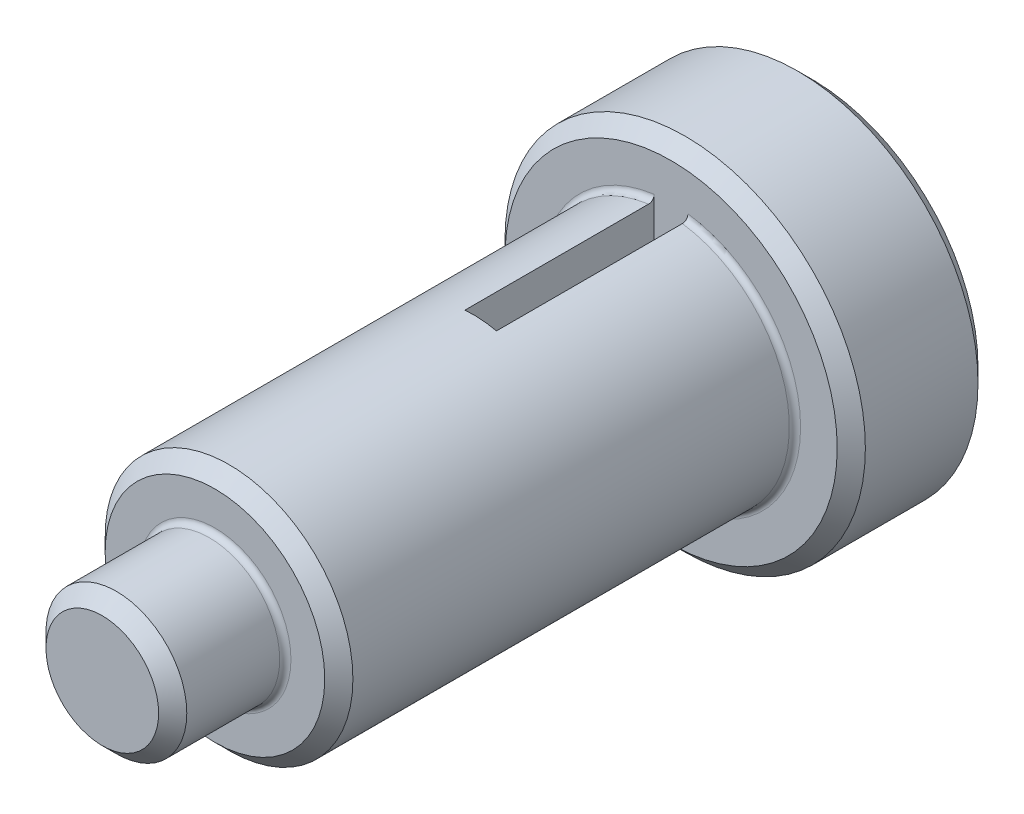
ISO-10303-21;
HEADER;
FILE_DESCRIPTION(('STEP AP214'),'2;1');
FILE_NAME('part.step','',(''),(''),'','','');
FILE_SCHEMA(('AUTOMOTIVE_DESIGN { 1 0 10303 214 1 1 1 1 }'));
ENDSEC;
DATA;
#1=APPLICATION_CONTEXT('core data for automotive mechanical design processes');
#2=APPLICATION_PROTOCOL_DEFINITION('international standard','automotive_design',2000,#1);
#3=PRODUCT_CONTEXT('',#1,'mechanical');
#4=PRODUCT('Part','Part','',(#3));
#5=PRODUCT_RELATED_PRODUCT_CATEGORY('part','',(#4));
#6=PRODUCT_DEFINITION_FORMATION('','',#4);
#7=PRODUCT_DEFINITION_CONTEXT('part definition',#1,'design');
#8=PRODUCT_DEFINITION('design','',#6,#7);
#9=PRODUCT_DEFINITION_SHAPE('','',#8);
#10=(LENGTH_UNIT() NAMED_UNIT(*) SI_UNIT(.MILLI.,.METRE.));
#11=(NAMED_UNIT(*) PLANE_ANGLE_UNIT() SI_UNIT($,.RADIAN.));
#12=(NAMED_UNIT(*) SI_UNIT($,.STERADIAN.) SOLID_ANGLE_UNIT());
#13=UNCERTAINTY_MEASURE_WITH_UNIT(LENGTH_MEASURE(1.E-05),#10,'distance_accuracy_value','');
#14=(GEOMETRIC_REPRESENTATION_CONTEXT(3) GLOBAL_UNCERTAINTY_ASSIGNED_CONTEXT((#13)) GLOBAL_UNIT_ASSIGNED_CONTEXT((#10,
#11,#12)) REPRESENTATION_CONTEXT('',''));
#15=CARTESIAN_POINT('',(0.,0.,0.));
#16=DIRECTION('',(0.,0.,1.));
#17=DIRECTION('',(1.,0.,0.));
#18=AXIS2_PLACEMENT_3D('',#15,#16,#17);
#19=CARTESIAN_POINT('',(0.,0.,25.));
#20=DIRECTION('',(0.,0.,-1.));
#21=DIRECTION('',(-1.,0.,0.));
#22=AXIS2_PLACEMENT_3D('',#19,#20,#21);
#23=CYLINDRICAL_SURFACE('',#22,32.);
#24=CARTESIAN_POINT('',(0.,0.,22.4999999999999));
#25=DIRECTION('',(0.,0.,1.));
#26=DIRECTION('',(1.,0.,0.));
#27=AXIS2_PLACEMENT_3D('',#24,#25,#26);
#28=CIRCLE('',#27,32.);
#29=CARTESIAN_POINT('',(32.,0.,22.4999999999999));
#30=VERTEX_POINT('',#29);
#31=EDGE_CURVE('E340',#30,#30,#28,.F.);
#32=ORIENTED_EDGE('',*,*,#31,.T.);
#33=EDGE_LOOP('',(#32));
#34=FACE_BOUND('',#33,.T.);
#35=CARTESIAN_POINT('',(0.,0.,2.50000000000002));
#36=DIRECTION('',(0.,0.,1.));
#37=DIRECTION('',(1.,0.,0.));
#38=AXIS2_PLACEMENT_3D('',#35,#36,#37);
#39=CIRCLE('',#38,32.);
#40=CARTESIAN_POINT('',(32.,0.,2.50000000000002));
#41=VERTEX_POINT('',#40);
#42=EDGE_CURVE('E337',#41,#41,#39,.T.);
#43=ORIENTED_EDGE('',*,*,#42,.T.);
#44=EDGE_LOOP('',(#43));
#45=FACE_BOUND('',#44,.T.);
#46=ADVANCED_FACE('F39',(#34,#45),#23,.T.);
#47=CARTESIAN_POINT('',(0.,0.,25.));
#48=DIRECTION('',(0.,0.,1.));
#49=DIRECTION('',(1.,0.,0.));
#50=AXIS2_PLACEMENT_3D('',#47,#48,#49);
#51=PLANE('',#50);
#52=CARTESIAN_POINT('',(0.,0.,25.));
#53=DIRECTION('',(0.,0.,1.));
#54=DIRECTION('',(1.,0.,0.));
#55=AXIS2_PLACEMENT_3D('',#52,#53,#54);
#56=CIRCLE('',#55,29.5);
#57=CARTESIAN_POINT('',(29.5,0.,25.));
#58=VERTEX_POINT('',#57);
#59=EDGE_CURVE('E330',#58,#58,#56,.T.);
#60=ORIENTED_EDGE('',*,*,#59,.T.);
#61=EDGE_LOOP('',(#60));
#62=FACE_BOUND('',#61,.T.);
#63=DIRECTION('',(0.,1.,0.));
#64=VECTOR('',#63,1.);
#65=CARTESIAN_POINT('',(3.,-32.,25.));
#66=LINE('',#65,#64);
#67=CARTESIAN_POINT('',(3.,15.7162336455017,25.));
#68=VERTEX_POINT('',#67);
#69=CARTESIAN_POINT('',(3.,22.8035085019828,25.));
#70=VERTEX_POINT('',#69);
#71=EDGE_CURVE('E60',#68,#70,#66,.T.);
#72=ORIENTED_EDGE('',*,*,#71,.T.);
#73=CARTESIAN_POINT('',(0.,0.,25.));
#74=DIRECTION('',(0.,0.,1.));
#75=DIRECTION('',(1.,0.,0.));
#76=AXIS2_PLACEMENT_3D('',#73,#74,#75);
#77=CIRCLE('',#76,23.);
#78=CARTESIAN_POINT('',(3.,-22.8035085019828,25.));
#79=VERTEX_POINT('',#78);
#80=EDGE_CURVE('E351',#70,#79,#77,.F.);
#81=ORIENTED_EDGE('',*,*,#80,.T.);
#82=CARTESIAN_POINT('',(3.,-15.7162336455017,25.));
#83=VERTEX_POINT('',#82);
#84=EDGE_CURVE('E68',#79,#83,#66,.T.);
#85=ORIENTED_EDGE('',*,*,#84,.T.);
#86=CARTESIAN_POINT('',(0.,0.,25.));
#87=DIRECTION('',(0.,0.,-1.));
#88=DIRECTION('',(-1.,0.,0.));
#89=AXIS2_PLACEMENT_3D('',#86,#87,#88);
#90=CIRCLE('',#89,16.);
#91=CARTESIAN_POINT('',(-2.99999999999999,-15.7162336455017,25.));
#92=VERTEX_POINT('',#91);
#93=EDGE_CURVE('E132',#92,#83,#90,.F.);
#94=ORIENTED_EDGE('',*,*,#93,.F.);
#95=DIRECTION('',(0.,1.,0.));
#96=VECTOR('',#95,1.);
#97=CARTESIAN_POINT('',(-2.99999999999999,-32.,25.));
#98=LINE('',#97,#96);
#99=CARTESIAN_POINT('',(-2.99999999999999,-22.8035085019828,25.));
#100=VERTEX_POINT('',#99);
#101=EDGE_CURVE('E139',#100,#92,#98,.T.);
#102=ORIENTED_EDGE('',*,*,#101,.F.);
#103=CARTESIAN_POINT('',(0.,0.,25.));
#104=DIRECTION('',(0.,0.,1.));
#105=DIRECTION('',(1.,0.,0.));
#106=AXIS2_PLACEMENT_3D('',#103,#104,#105);
#107=CIRCLE('',#106,23.);
#108=CARTESIAN_POINT('',(-2.99999999999999,22.8035085019828,25.));
#109=VERTEX_POINT('',#108);
#110=EDGE_CURVE('E137',#100,#109,#107,.F.);
#111=ORIENTED_EDGE('',*,*,#110,.T.);
#112=CARTESIAN_POINT('',(-2.99999999999999,15.7162336455017,25.));
#113=VERTEX_POINT('',#112);
#114=EDGE_CURVE('E123',#113,#109,#98,.T.);
#115=ORIENTED_EDGE('',*,*,#114,.F.);
#116=EDGE_CURVE('E135',#68,#113,#90,.F.);
#117=ORIENTED_EDGE('',*,*,#116,.F.);
#118=EDGE_LOOP('',(#72,#81,#85,#94,#102,#111,#115,#117));
#119=FACE_BOUND('',#118,.T.);
#120=ADVANCED_FACE('F134',(#62,#119),#51,.T.);
#121=CARTESIAN_POINT('',(0.,0.,0.));
#122=DIRECTION('',(0.,0.,1.));
#123=DIRECTION('',(1.,0.,0.));
#124=AXIS2_PLACEMENT_3D('',#121,#122,#123);
#125=PLANE('',#124);
#126=CARTESIAN_POINT('',(0.,0.,0.));
#127=DIRECTION('',(0.,0.,1.));
#128=DIRECTION('',(1.,0.,0.));
#129=AXIS2_PLACEMENT_3D('',#126,#127,#128);
#130=CIRCLE('',#129,29.5);
#131=CARTESIAN_POINT('',(29.5,0.,0.));
#132=VERTEX_POINT('',#131);
#133=EDGE_CURVE('E342',#132,#132,#130,.F.);
#134=ORIENTED_EDGE('',*,*,#133,.T.);
#135=EDGE_LOOP('',(#134));
#136=FACE_BOUND('',#135,.T.);
#137=CARTESIAN_POINT('',(0.,0.,0.));
#138=DIRECTION('',(0.,0.,-1.));
#139=DIRECTION('',(-1.,0.,0.));
#140=AXIS2_PLACEMENT_3D('',#137,#138,#139);
#141=CIRCLE('',#140,16.);
#142=CARTESIAN_POINT('',(-16.,0.,0.));
#143=VERTEX_POINT('',#142);
#144=EDGE_CURVE('E164',#143,#143,#141,.T.);
#145=ORIENTED_EDGE('',*,*,#144,.F.);
#146=EDGE_LOOP('',(#145));
#147=FACE_BOUND('',#146,.T.);
#148=ADVANCED_FACE('F218',(#136,#147),#125,.F.);
#149=CARTESIAN_POINT('',(0.,0.,106.));
#150=DIRECTION('',(0.,0.,-1.));
#151=DIRECTION('',(-1.,0.,0.));
#152=AXIS2_PLACEMENT_3D('',#149,#150,#151);
#153=CYLINDRICAL_SURFACE('',#152,22.);
#154=CARTESIAN_POINT('',(0.,0.,103.5));
#155=DIRECTION('',(0.,0.,1.));
#156=DIRECTION('',(1.,0.,0.));
#157=AXIS2_PLACEMENT_3D('',#154,#155,#156);
#158=CIRCLE('',#157,22.);
#159=CARTESIAN_POINT('',(22.,0.,103.5));
#160=VERTEX_POINT('',#159);
#161=EDGE_CURVE('E327',#160,#160,#158,.F.);
#162=ORIENTED_EDGE('',*,*,#161,.T.);
#163=EDGE_LOOP('',(#162));
#164=FACE_BOUND('',#163,.T.);
#165=DIRECTION('',(0.,0.,-1.));
#166=VECTOR('',#165,1.);
#167=CARTESIAN_POINT('',(3.00000000000002,-21.7944947177034,106.));
#168=LINE('',#167,#166);
#169=CARTESIAN_POINT('',(3.00000000000001,-21.7944947177034,59.));
#170=VERTEX_POINT('',#169);
#171=CARTESIAN_POINT('',(3.00000000000002,-21.7944947177034,26.));
#172=VERTEX_POINT('',#171);
#173=EDGE_CURVE('E167',#170,#172,#168,.T.);
#174=ORIENTED_EDGE('',*,*,#173,.T.);
#175=CARTESIAN_POINT('',(0.,0.,26.));
#176=DIRECTION('',(0.,0.,1.));
#177=DIRECTION('',(1.,0.,0.));
#178=AXIS2_PLACEMENT_3D('',#175,#176,#177);
#179=CIRCLE('',#178,22.);
#180=CARTESIAN_POINT('',(3.00000000000002,21.7944947177034,26.));
#181=VERTEX_POINT('',#180);
#182=EDGE_CURVE('E349',#172,#181,#179,.T.);
#183=ORIENTED_EDGE('',*,*,#182,.T.);
#184=DIRECTION('',(0.,0.,-1.));
#185=VECTOR('',#184,1.);
#186=CARTESIAN_POINT('',(3.00000000000002,21.7944947177034,106.));
#187=LINE('',#186,#185);
#188=CARTESIAN_POINT('',(3.00000000000001,21.7944947177034,59.));
#189=VERTEX_POINT('',#188);
#190=EDGE_CURVE('E172',#181,#189,#187,.F.);
#191=ORIENTED_EDGE('',*,*,#190,.T.);
#192=CARTESIAN_POINT('',(0.,0.,58.8007402198552));
#193=DIRECTION('',(-0.0662739003999969,0.,0.99780146829205));
#194=DIRECTION('',(-0.99780146829205,0.,-0.0662739003999969));
#195=AXIS2_PLACEMENT_3D('',#192,#193,#194);
#196=ELLIPSE('',#195,22.0484742697941,22.);
#197=CARTESIAN_POINT('',(-2.99999999999999,21.7944947177034,58.6014804397105));
#198=VERTEX_POINT('',#197);
#199=EDGE_CURVE('E175',#189,#198,#196,.T.);
#200=ORIENTED_EDGE('',*,*,#199,.T.);
#201=DIRECTION('',(0.,0.,-1.));
#202=VECTOR('',#201,1.);
#203=CARTESIAN_POINT('',(-2.99999999999999,21.7944947177034,106.));
#204=LINE('',#203,#202);
#205=CARTESIAN_POINT('',(-2.99999999999999,21.7944947177034,26.));
#206=VERTEX_POINT('',#205);
#207=EDGE_CURVE('E178',#198,#206,#204,.T.);
#208=ORIENTED_EDGE('',*,*,#207,.T.);
#209=CARTESIAN_POINT('',(0.,0.,26.));
#210=DIRECTION('',(0.,0.,1.));
#211=DIRECTION('',(1.,0.,0.));
#212=AXIS2_PLACEMENT_3D('',#209,#210,#211);
#213=CIRCLE('',#212,22.);
#214=CARTESIAN_POINT('',(-2.99999999999999,-21.7944947177034,26.));
#215=VERTEX_POINT('',#214);
#216=EDGE_CURVE('E205',#206,#215,#213,.T.);
#217=ORIENTED_EDGE('',*,*,#216,.T.);
#218=DIRECTION('',(0.,0.,-1.));
#219=VECTOR('',#218,1.);
#220=CARTESIAN_POINT('',(-2.99999999999999,-21.7944947177034,106.));
#221=LINE('',#220,#219);
#222=CARTESIAN_POINT('',(-2.99999999999999,-21.7944947177034,58.6014804397105));
#223=VERTEX_POINT('',#222);
#224=EDGE_CURVE('E181',#215,#223,#221,.F.);
#225=ORIENTED_EDGE('',*,*,#224,.T.);
#226=EDGE_CURVE('E174',#223,#170,#196,.T.);
#227=ORIENTED_EDGE('',*,*,#226,.T.);
#228=EDGE_LOOP('',(#174,#183,#191,#200,#208,#217,#225,#227));
#229=FACE_BOUND('',#228,.T.);
#230=ADVANCED_FACE('F198',(#164,#229),#153,.T.);
#231=CARTESIAN_POINT('',(0.,0.,106.));
#232=DIRECTION('',(0.,0.,1.));
#233=DIRECTION('',(1.,0.,0.));
#234=AXIS2_PLACEMENT_3D('',#231,#232,#233);
#235=PLANE('',#234);
#236=CARTESIAN_POINT('',(0.,0.,106.));
#237=DIRECTION('',(0.,0.,1.));
#238=DIRECTION('',(1.,0.,0.));
#239=AXIS2_PLACEMENT_3D('',#236,#237,#238);
#240=CIRCLE('',#239,13.5);
#241=CARTESIAN_POINT('',(13.5,0.,106.));
#242=VERTEX_POINT('',#241);
#243=EDGE_CURVE('E322',#242,#242,#240,.F.);
#244=ORIENTED_EDGE('',*,*,#243,.T.);
#245=EDGE_LOOP('',(#244));
#246=FACE_BOUND('',#245,.T.);
#247=CARTESIAN_POINT('',(0.,0.,106.));
#248=DIRECTION('',(0.,0.,1.));
#249=DIRECTION('',(1.,0.,0.));
#250=AXIS2_PLACEMENT_3D('',#247,#248,#249);
#251=CIRCLE('',#250,19.5);
#252=CARTESIAN_POINT('',(19.5,0.,106.));
#253=VERTEX_POINT('',#252);
#254=EDGE_CURVE('E325',#253,#253,#251,.T.);
#255=ORIENTED_EDGE('',*,*,#254,.T.);
#256=EDGE_LOOP('',(#255));
#257=FACE_BOUND('',#256,.T.);
#258=ADVANCED_FACE('F226',(#246,#257),#235,.T.);
#259=CARTESIAN_POINT('',(0.,0.,126.));
#260=DIRECTION('',(0.,0.,-1.));
#261=DIRECTION('',(-1.,0.,0.));
#262=AXIS2_PLACEMENT_3D('',#259,#260,#261);
#263=CYLINDRICAL_SURFACE('',#262,12.5);
#264=CARTESIAN_POINT('',(0.,0.,107.));
#265=DIRECTION('',(0.,0.,1.));
#266=DIRECTION('',(1.,0.,0.));
#267=AXIS2_PLACEMENT_3D('',#264,#265,#266);
#268=CIRCLE('',#267,12.5);
#269=CARTESIAN_POINT('',(12.5,0.,107.));
#270=VERTEX_POINT('',#269);
#271=EDGE_CURVE('E344',#270,#270,#268,.T.);
#272=ORIENTED_EDGE('',*,*,#271,.T.);
#273=EDGE_LOOP('',(#272));
#274=FACE_BOUND('',#273,.T.);
#275=CARTESIAN_POINT('',(0.,0.,123.5));
#276=DIRECTION('',(0.,0.,1.));
#277=DIRECTION('',(1.,0.,0.));
#278=AXIS2_PLACEMENT_3D('',#275,#276,#277);
#279=CIRCLE('',#278,12.5);
#280=CARTESIAN_POINT('',(12.5,0.,123.5));
#281=VERTEX_POINT('',#280);
#282=EDGE_CURVE('E148',#281,#281,#279,.F.);
#283=ORIENTED_EDGE('',*,*,#282,.T.);
#284=EDGE_LOOP('',(#283));
#285=FACE_BOUND('',#284,.T.);
#286=ADVANCED_FACE('F310',(#274,#285),#263,.T.);
#287=CARTESIAN_POINT('',(0.,0.,126.));
#288=DIRECTION('',(0.,0.,1.));
#289=DIRECTION('',(1.,0.,0.));
#290=AXIS2_PLACEMENT_3D('',#287,#288,#289);
#291=PLANE('',#290);
#292=CARTESIAN_POINT('',(0.,0.,126.));
#293=DIRECTION('',(0.,0.,1.));
#294=DIRECTION('',(1.,0.,0.));
#295=AXIS2_PLACEMENT_3D('',#292,#293,#294);
#296=CIRCLE('',#295,9.99999999999997);
#297=CARTESIAN_POINT('',(9.99999999999997,0.,126.));
#298=VERTEX_POINT('',#297);
#299=EDGE_CURVE('E145',#298,#298,#296,.T.);
#300=ORIENTED_EDGE('',*,*,#299,.T.);
#301=EDGE_LOOP('',(#300));
#302=FACE_BOUND('',#301,.T.);
#303=ADVANCED_FACE('F212',(#302),#291,.T.);
#304=CARTESIAN_POINT('',(0.,0.,77.));
#305=DIRECTION('',(0.,0.,-1.));
#306=DIRECTION('',(-1.,0.,0.));
#307=AXIS2_PLACEMENT_3D('',#304,#305,#306);
#308=CYLINDRICAL_SURFACE('',#307,16.);
#309=DIRECTION('',(0.,0.,-1.));
#310=VECTOR('',#309,1.);
#311=CARTESIAN_POINT('',(3.00000000000001,15.7162336455017,77.));
#312=LINE('',#311,#310);
#313=CARTESIAN_POINT('',(3.00000000000001,15.7162336455017,59.));
#314=VERTEX_POINT('',#313);
#315=EDGE_CURVE('E144',#314,#68,#312,.T.);
#316=ORIENTED_EDGE('',*,*,#315,.T.);
#317=ORIENTED_EDGE('',*,*,#116,.T.);
#318=DIRECTION('',(0.,0.,-1.));
#319=VECTOR('',#318,1.);
#320=CARTESIAN_POINT('',(-2.99999999999999,15.7162336455017,77.));
#321=LINE('',#320,#319);
#322=CARTESIAN_POINT('',(-2.99999999999999,15.7162336455017,58.6014804397105));
#323=VERTEX_POINT('',#322);
#324=EDGE_CURVE('E120',#113,#323,#321,.F.);
#325=ORIENTED_EDGE('',*,*,#324,.T.);
#326=CARTESIAN_POINT('',(0.,0.,58.8007402198552));
#327=DIRECTION('',(-0.0662739003999969,0.,0.99780146829205));
#328=DIRECTION('',(-0.99780146829205,0.,-0.0662739003999969));
#329=AXIS2_PLACEMENT_3D('',#326,#327,#328);
#330=ELLIPSE('',#329,16.0352540143957,16.);
#331=EDGE_CURVE('E131',#323,#314,#330,.F.);
#332=ORIENTED_EDGE('',*,*,#331,.T.);
#333=EDGE_LOOP('',(#316,#317,#325,#332));
#334=FACE_BOUND('',#333,.T.);
#335=DIRECTION('',(0.,0.,-1.));
#336=VECTOR('',#335,1.);
#337=CARTESIAN_POINT('',(-2.99999999999999,-15.7162336455017,77.));
#338=LINE('',#337,#336);
#339=CARTESIAN_POINT('',(-2.99999999999999,-15.7162336455017,58.6014804397105));
#340=VERTEX_POINT('',#339);
#341=EDGE_CURVE('E159',#340,#92,#338,.T.);
#342=ORIENTED_EDGE('',*,*,#341,.T.);
#343=ORIENTED_EDGE('',*,*,#93,.T.);
#344=DIRECTION('',(0.,0.,-1.));
#345=VECTOR('',#344,1.);
#346=CARTESIAN_POINT('',(3.00000000000001,-15.7162336455017,77.));
#347=LINE('',#346,#345);
#348=CARTESIAN_POINT('',(3.00000000000001,-15.7162336455017,59.));
#349=VERTEX_POINT('',#348);
#350=EDGE_CURVE('E153',#83,#349,#347,.F.);
#351=ORIENTED_EDGE('',*,*,#350,.T.);
#352=EDGE_CURVE('E157',#349,#340,#330,.F.);
#353=ORIENTED_EDGE('',*,*,#352,.T.);
#354=EDGE_LOOP('',(#342,#343,#351,#353));
#355=FACE_BOUND('',#354,.T.);
#356=CARTESIAN_POINT('',(0.,0.,77.));
#357=DIRECTION('',(0.,0.,-1.));
#358=DIRECTION('',(-1.,0.,0.));
#359=AXIS2_PLACEMENT_3D('',#356,#357,#358);
#360=CIRCLE('',#359,16.);
#361=CARTESIAN_POINT('',(-16.,0.,77.));
#362=VERTEX_POINT('',#361);
#363=EDGE_CURVE('E163',#362,#362,#360,.T.);
#364=ORIENTED_EDGE('',*,*,#363,.F.);
#365=EDGE_LOOP('',(#364));
#366=FACE_BOUND('',#365,.T.);
#367=ORIENTED_EDGE('',*,*,#144,.T.);
#368=EDGE_LOOP('',(#367));
#369=FACE_BOUND('',#368,.T.);
#370=ADVANCED_FACE('F142',(#334,#355,#366,#369),#308,.F.);
#371=CARTESIAN_POINT('',(0.,0.,77.));
#372=DIRECTION('',(0.,0.,-1.));
#373=DIRECTION('',(-1.,0.,0.));
#374=AXIS2_PLACEMENT_3D('',#371,#372,#373);
#375=PLANE('',#374);
#376=ORIENTED_EDGE('',*,*,#363,.T.);
#377=EDGE_LOOP('',(#376));
#378=FACE_BOUND('',#377,.T.);
#379=ADVANCED_FACE('F211',(#378),#375,.T.);
#380=CARTESIAN_POINT('',(-2.99999999999999,-32.,58.6014804397105));
#381=DIRECTION('',(-1.,0.,0.));
#382=DIRECTION('',(0.,0.,1.));
#383=AXIS2_PLACEMENT_3D('',#380,#381,#382);
#384=PLANE('',#383);
#385=ORIENTED_EDGE('',*,*,#101,.T.);
#386=ORIENTED_EDGE('',*,*,#341,.F.);
#387=DIRECTION('',(0.,1.,0.));
#388=VECTOR('',#387,1.);
#389=CARTESIAN_POINT('',(-2.99999999999999,-32.,58.6014804397105));
#390=LINE('',#389,#388);
#391=EDGE_CURVE('E184',#223,#340,#390,.T.);
#392=ORIENTED_EDGE('',*,*,#391,.F.);
#393=ORIENTED_EDGE('',*,*,#224,.F.);
#394=CARTESIAN_POINT('',(-2.99999999999999,-21.7944947177034,26.));
#395=CARTESIAN_POINT('',(-2.99999999999999,-21.7944947584057,25.9720535438474));
#396=CARTESIAN_POINT('',(-2.99999999999999,-21.7956780246763,25.9441205459037));
#397=CARTESIAN_POINT('',(-2.99999999999999,-21.8003975695991,25.888455960322));
#398=CARTESIAN_POINT('',(-2.99999999999999,-21.8039336896457,25.8607243592352));
#399=CARTESIAN_POINT('',(-2.99999999999999,-21.8180333723844,25.7781933056707));
#400=CARTESIAN_POINT('',(-2.99999999999999,-21.8320883774521,25.7239491380712));
#401=CARTESIAN_POINT('',(-2.99999999999999,-21.8690968362246,25.6185957914184));
#402=CARTESIAN_POINT('',(-2.99999999999999,-21.8920537158097,25.5674878281127));
#403=CARTESIAN_POINT('',(-2.99999999999999,-21.9461854380495,25.469827731487));
#404=CARTESIAN_POINT('',(-2.99999999999999,-21.9773594724929,25.4232751507323));
#405=CARTESIAN_POINT('',(-2.99999999999999,-22.0471650705035,25.335826828616));
#406=CARTESIAN_POINT('',(-2.99999999999999,-22.0858274506649,25.2949557048929));
#407=CARTESIAN_POINT('',(-2.99999999999999,-22.1694201905245,25.2202074866751));
#408=CARTESIAN_POINT('',(-2.99999999999999,-22.2143518890302,25.1863318899112));
#409=CARTESIAN_POINT('',(-2.99999999999999,-22.3096258754838,25.1262264743049));
#410=CARTESIAN_POINT('',(-2.99999999999999,-22.3600129282436,25.1000676897524));
#411=CARTESIAN_POINT('',(-2.99999999999999,-22.464431853289,25.0565173555659));
#412=CARTESIAN_POINT('',(-2.99999999999999,-22.51846200908,25.0391217093454));
#413=CARTESIAN_POINT('',(-2.99999999999999,-22.6112271108058,25.017585938519));
#414=CARTESIAN_POINT('',(-2.99999999999999,-22.6494119037235,25.0109955531542));
#415=CARTESIAN_POINT('',(-2.99999999999999,-22.7262289826571,25.0022028826514));
#416=CARTESIAN_POINT('',(-2.99999999999999,-22.7648605655181,24.9999944527307));
#417=CARTESIAN_POINT('',(-2.99999999999999,-22.8035085019828,25.));
#418=B_SPLINE_CURVE_WITH_KNOTS('',3,(#394,#395,#396,#397,#398,#399,#400,#401,#402,#403,#404,
#405,#406,#407,#408,#409,#410,#411,#412,#413,#414,#415,#416,#417),.UNSPECIFIED.,.F.,.F.,(4,2,2,
2,2,2,2,2,2,2,2,4),(0.,0.0837876338741358,0.167569620205366,0.334812358805318,0.502119524643,
0.669410240858237,0.837404621560849,1.00543493238049,1.17496689607609,1.34441953335984,
1.46043135733484,1.57628038351238),.UNSPECIFIED.);
#419=EDGE_CURVE('E53',#215,#100,#418,.T.);
#420=ORIENTED_EDGE('',*,*,#419,.T.);
#421=EDGE_LOOP('',(#385,#386,#392,#393,#420));
#422=FACE_BOUND('',#421,.T.);
#423=ADVANCED_FACE('F208',(#422),#384,.F.);
#424=CARTESIAN_POINT('',(3.00000000000001,-32.,59.));
#425=DIRECTION('',(-0.0662739003999969,0.,0.99780146829205));
#426=DIRECTION('',(0.99780146829205,0.,0.0662739003999969));
#427=AXIS2_PLACEMENT_3D('',#424,#425,#426);
#428=PLANE('',#427);
#429=ORIENTED_EDGE('',*,*,#391,.T.);
#430=ORIENTED_EDGE('',*,*,#352,.F.);
#431=DIRECTION('',(0.,1.,0.));
#432=VECTOR('',#431,1.);
#433=CARTESIAN_POINT('',(3.00000000000001,-32.,59.));
#434=LINE('',#433,#432);
#435=EDGE_CURVE('E188',#170,#349,#434,.T.);
#436=ORIENTED_EDGE('',*,*,#435,.F.);
#437=ORIENTED_EDGE('',*,*,#226,.F.);
#438=EDGE_LOOP('',(#429,#430,#436,#437));
#439=FACE_BOUND('',#438,.T.);
#440=ADVANCED_FACE('F196',(#439),#428,.F.);
#441=CARTESIAN_POINT('',(3.,-32.,25.));
#442=DIRECTION('',(1.,0.,0.));
#443=DIRECTION('',(0.,0.,-1.));
#444=AXIS2_PLACEMENT_3D('',#441,#442,#443);
#445=PLANE('',#444);
#446=ORIENTED_EDGE('',*,*,#435,.T.);
#447=ORIENTED_EDGE('',*,*,#350,.F.);
#448=ORIENTED_EDGE('',*,*,#84,.F.);
#449=CARTESIAN_POINT('',(3.,-22.8035085019828,25.));
#450=CARTESIAN_POINT('',(3.,-22.77493801965,25.000000318813));
#451=CARTESIAN_POINT('',(3.,-22.7463812012701,25.0012043190022));
#452=CARTESIAN_POINT('',(3.,-22.6894707957652,25.0060079776862));
#453=CARTESIAN_POINT('',(3.,-22.661117201755,25.0096075546273));
#454=CARTESIAN_POINT('',(3.,-22.5767019192349,25.0239686510445));
#455=CARTESIAN_POINT('',(3.,-22.5212038447119,25.0382926126203));
#456=CARTESIAN_POINT('',(3.,-22.4133987971899,25.0760604349566));
#457=CARTESIAN_POINT('',(3.,-22.3610935941814,25.0995093019999));
#458=CARTESIAN_POINT('',(3.,-22.2611853617392,25.1548829011076));
#459=CARTESIAN_POINT('',(3.,-22.2135812138377,25.1868056103907));
#460=CARTESIAN_POINT('',(3.,-22.1246217649544,25.2581154813239));
#461=CARTESIAN_POINT('',(3.,-22.0832445028801,25.2974752501301));
#462=CARTESIAN_POINT('',(3.,-22.0077441510398,25.3826456207164));
#463=CARTESIAN_POINT('',(3.,-21.973622335318,25.4284573531068));
#464=CARTESIAN_POINT('',(3.,-21.9139182829046,25.5248153353783));
#465=CARTESIAN_POINT('',(3.,-21.8882681451684,25.5753195643545));
#466=CARTESIAN_POINT('',(3.,-21.8459083394548,25.6799304637831));
#467=CARTESIAN_POINT('',(3.,-21.8291922458575,25.7340345135621));
#468=CARTESIAN_POINT('',(3.,-21.8096489724805,25.8237645751905));
#469=CARTESIAN_POINT('',(3.,-21.8039695443258,25.8587948917398));
#470=CARTESIAN_POINT('',(3.,-21.7963931556507,25.9292115642896));
#471=CARTESIAN_POINT('',(3.,-21.7944908170312,25.9645973418469));
#472=CARTESIAN_POINT('',(3.,-21.7944947177034,26.));
#473=B_SPLINE_CURVE_WITH_KNOTS('',3,(#449,#450,#451,#452,#453,#454,#455,#456,#457,#458,#459,
#460,#461,#462,#463,#464,#465,#466,#467,#468,#469,#470,#471,#472),.UNSPECIFIED.,.F.,.F.,(4,2,2,
2,2,2,2,2,2,2,2,4),(0.,0.0856589306631857,0.171314945351224,0.342384434040744,0.513547910819768,
0.684670566044809,0.855174797988134,1.02570894551072,1.19484106163954,1.36385136885504,
1.47012679358366,1.57625078668017),.UNSPECIFIED.);
#474=EDGE_CURVE('E285',#79,#172,#473,.T.);
#475=ORIENTED_EDGE('',*,*,#474,.T.);
#476=ORIENTED_EDGE('',*,*,#173,.F.);
#477=EDGE_LOOP('',(#446,#447,#448,#475,#476));
#478=FACE_BOUND('',#477,.T.);
#479=ADVANCED_FACE('F191',(#478),#445,.F.);
#480=ORIENTED_EDGE('',*,*,#71,.F.);
#481=ORIENTED_EDGE('',*,*,#315,.F.);
#482=EDGE_CURVE('E185',#314,#189,#434,.T.);
#483=ORIENTED_EDGE('',*,*,#482,.T.);
#484=ORIENTED_EDGE('',*,*,#190,.F.);
#485=CARTESIAN_POINT('',(3.00000000000002,21.7944947177034,26.));
#486=CARTESIAN_POINT('',(3.00000000000001,21.7944947584057,25.9720535438474));
#487=CARTESIAN_POINT('',(3.,21.7956780246763,25.9441205459037));
#488=CARTESIAN_POINT('',(3.,21.8003975695991,25.888455960322));
#489=CARTESIAN_POINT('',(3.,21.8039336896457,25.8607243592352));
#490=CARTESIAN_POINT('',(3.,21.8180333723843,25.7781933056707));
#491=CARTESIAN_POINT('',(3.,21.8320883774521,25.7239491380712));
#492=CARTESIAN_POINT('',(3.,21.8690968362246,25.6185957914184));
#493=CARTESIAN_POINT('',(3.,21.8920537158097,25.5674878281127));
#494=CARTESIAN_POINT('',(3.,21.9461854380495,25.469827731487));
#495=CARTESIAN_POINT('',(3.,21.9773594724929,25.4232751507323));
#496=CARTESIAN_POINT('',(3.,22.0471650705035,25.335826828616));
#497=CARTESIAN_POINT('',(3.,22.0858274506649,25.2949557048929));
#498=CARTESIAN_POINT('',(3.,22.1694201905245,25.2202074866751));
#499=CARTESIAN_POINT('',(3.,22.2143518890302,25.1863318899112));
#500=CARTESIAN_POINT('',(3.,22.3096258754838,25.1262264743049));
#501=CARTESIAN_POINT('',(3.,22.3600129282436,25.1000676897524));
#502=CARTESIAN_POINT('',(3.,22.464431853289,25.0565173555659));
#503=CARTESIAN_POINT('',(3.,22.51846200908,25.0391217093454));
#504=CARTESIAN_POINT('',(3.,22.6112271108057,25.017585938519));
#505=CARTESIAN_POINT('',(3.,22.6494119037235,25.0109955531542));
#506=CARTESIAN_POINT('',(3.,22.7262289826571,25.0022028826514));
#507=CARTESIAN_POINT('',(3.,22.7648605655181,24.9999944527307));
#508=CARTESIAN_POINT('',(3.,22.8035085019828,25.));
#509=B_SPLINE_CURVE_WITH_KNOTS('',3,(#485,#486,#487,#488,#489,#490,#491,#492,#493,#494,#495,
#496,#497,#498,#499,#500,#501,#502,#503,#504,#505,#506,#507,#508),.UNSPECIFIED.,.F.,.F.,(4,2,2,
2,2,2,2,2,2,2,2,4),(0.,0.0837876338741394,0.167569620205366,0.334812358805315,0.502119524642996,
0.669410240858233,0.837404621560844,1.00543493238049,1.17496689607608,1.34441953335983,
1.46043135733484,1.57628038351238),.UNSPECIFIED.);
#510=EDGE_CURVE('E277',#181,#70,#509,.T.);
#511=ORIENTED_EDGE('',*,*,#510,.T.);
#512=EDGE_LOOP('',(#480,#481,#483,#484,#511));
#513=FACE_BOUND('',#512,.T.);
#514=ADVANCED_FACE('F297',(#513),#445,.F.);
#515=ORIENTED_EDGE('',*,*,#482,.F.);
#516=ORIENTED_EDGE('',*,*,#331,.F.);
#517=EDGE_CURVE('E126',#323,#198,#390,.T.);
#518=ORIENTED_EDGE('',*,*,#517,.T.);
#519=ORIENTED_EDGE('',*,*,#199,.F.);
#520=EDGE_LOOP('',(#515,#516,#518,#519));
#521=FACE_BOUND('',#520,.T.);
#522=ADVANCED_FACE('F300',(#521),#428,.F.);
#523=ORIENTED_EDGE('',*,*,#517,.F.);
#524=ORIENTED_EDGE('',*,*,#324,.F.);
#525=ORIENTED_EDGE('',*,*,#114,.T.);
#526=CARTESIAN_POINT('',(-2.99999999999999,22.8035085019828,25.));
#527=CARTESIAN_POINT('',(-2.99999999999999,22.77493801965,25.000000318813));
#528=CARTESIAN_POINT('',(-2.99999999999999,22.7463812012701,25.0012043190022));
#529=CARTESIAN_POINT('',(-2.99999999999999,22.6894707957652,25.0060079776862));
#530=CARTESIAN_POINT('',(-2.99999999999999,22.661117201755,25.0096075546273));
#531=CARTESIAN_POINT('',(-2.99999999999999,22.5767019192349,25.0239686510445));
#532=CARTESIAN_POINT('',(-2.99999999999999,22.5212038447119,25.0382926126203));
#533=CARTESIAN_POINT('',(-2.99999999999999,22.4133987971899,25.0760604349566));
#534=CARTESIAN_POINT('',(-2.99999999999999,22.3610935941814,25.0995093019999));
#535=CARTESIAN_POINT('',(-2.99999999999999,22.2611853617392,25.1548829011076));
#536=CARTESIAN_POINT('',(-2.99999999999999,22.2135812138377,25.1868056103907));
#537=CARTESIAN_POINT('',(-2.99999999999999,22.1246217649544,25.2581154813239));
#538=CARTESIAN_POINT('',(-2.99999999999999,22.0832445028801,25.2974752501301));
#539=CARTESIAN_POINT('',(-2.99999999999999,22.0077441510398,25.3826456207164));
#540=CARTESIAN_POINT('',(-2.99999999999999,21.973622335318,25.4284573531068));
#541=CARTESIAN_POINT('',(-2.99999999999999,21.9139182829046,25.5248153353783));
#542=CARTESIAN_POINT('',(-2.99999999999999,21.8882681451684,25.5753195643545));
#543=CARTESIAN_POINT('',(-2.99999999999999,21.8459083394548,25.6799304637831));
#544=CARTESIAN_POINT('',(-2.99999999999999,21.8291922458575,25.7340345135621));
#545=CARTESIAN_POINT('',(-2.99999999999999,21.8096489724805,25.8237645751905));
#546=CARTESIAN_POINT('',(-2.99999999999999,21.8039695443258,25.8587948917398));
#547=CARTESIAN_POINT('',(-2.99999999999999,21.7963931556507,25.9292115642896));
#548=CARTESIAN_POINT('',(-2.99999999999999,21.7944908170311,25.9645973418469));
#549=CARTESIAN_POINT('',(-2.99999999999999,21.7944947177034,26.));
#550=B_SPLINE_CURVE_WITH_KNOTS('',3,(#526,#527,#528,#529,#530,#531,#532,#533,#534,#535,#536,
#537,#538,#539,#540,#541,#542,#543,#544,#545,#546,#547,#548,#549),.UNSPECIFIED.,.F.,.F.,(4,2,2,
2,2,2,2,2,2,2,2,4),(0.,0.0856589306631857,0.171314945351224,0.342384434040744,0.513547910819768,
0.684670566044809,0.855174797988132,1.02570894551072,1.19484106163954,1.36385136885504,
1.47012679358366,1.57625078668016),.UNSPECIFIED.);
#551=EDGE_CURVE('E11',#109,#206,#550,.T.);
#552=ORIENTED_EDGE('',*,*,#551,.T.);
#553=ORIENTED_EDGE('',*,*,#207,.F.);
#554=EDGE_LOOP('',(#523,#524,#525,#552,#553));
#555=FACE_BOUND('',#554,.T.);
#556=ADVANCED_FACE('F122',(#555),#384,.F.);
#557=CARTESIAN_POINT('',(0.,0.,126.));
#558=DIRECTION('',(0.,0.,-1.));
#559=DIRECTION('',(-1.,0.,0.));
#560=AXIS2_PLACEMENT_3D('',#557,#558,#559);
#561=CONICAL_SURFACE('',#560,9.99999999999997,0.785398163397449);
#562=ORIENTED_EDGE('',*,*,#282,.F.);
#563=EDGE_LOOP('',(#562));
#564=FACE_BOUND('',#563,.T.);
#565=ORIENTED_EDGE('',*,*,#299,.F.);
#566=EDGE_LOOP('',(#565));
#567=FACE_BOUND('',#566,.T.);
#568=ADVANCED_FACE('F241',(#564,#567),#561,.T.);
#569=CARTESIAN_POINT('',(0.,0.,106.));
#570=DIRECTION('',(0.,0.,-1.));
#571=DIRECTION('',(-1.,0.,0.));
#572=AXIS2_PLACEMENT_3D('',#569,#570,#571);
#573=CONICAL_SURFACE('',#572,19.5,0.78539816339745);
#574=ORIENTED_EDGE('',*,*,#161,.F.);
#575=EDGE_LOOP('',(#574));
#576=FACE_BOUND('',#575,.T.);
#577=ORIENTED_EDGE('',*,*,#254,.F.);
#578=EDGE_LOOP('',(#577));
#579=FACE_BOUND('',#578,.T.);
#580=ADVANCED_FACE('F247',(#576,#579),#573,.T.);
#581=CARTESIAN_POINT('',(0.,0.,25.));
#582=DIRECTION('',(0.,0.,-1.));
#583=DIRECTION('',(-1.,0.,0.));
#584=AXIS2_PLACEMENT_3D('',#581,#582,#583);
#585=CONICAL_SURFACE('',#584,29.5,0.785398163397446);
#586=ORIENTED_EDGE('',*,*,#31,.F.);
#587=EDGE_LOOP('',(#586));
#588=FACE_BOUND('',#587,.T.);
#589=ORIENTED_EDGE('',*,*,#59,.F.);
#590=EDGE_LOOP('',(#589));
#591=FACE_BOUND('',#590,.T.);
#592=ADVANCED_FACE('F254',(#588,#591),#585,.T.);
#593=CARTESIAN_POINT('',(0.,0.,2.50000000000002));
#594=DIRECTION('',(0.,0.,1.));
#595=DIRECTION('',(1.,0.,0.));
#596=AXIS2_PLACEMENT_3D('',#593,#594,#595);
#597=CONICAL_SURFACE('',#596,32.,0.785398163397451);
#598=ORIENTED_EDGE('',*,*,#133,.F.);
#599=EDGE_LOOP('',(#598));
#600=FACE_BOUND('',#599,.T.);
#601=ORIENTED_EDGE('',*,*,#42,.F.);
#602=EDGE_LOOP('',(#601));
#603=FACE_BOUND('',#602,.T.);
#604=ADVANCED_FACE('F261',(#600,#603),#597,.T.);
#605=CARTESIAN_POINT('',(0.,0.,107.));
#606=DIRECTION('',(0.,0.,1.));
#607=DIRECTION('',(1.,0.,0.));
#608=AXIS2_PLACEMENT_3D('',#605,#606,#607);
#609=TOROIDAL_SURFACE('',#608,13.5,1.);
#610=ORIENTED_EDGE('',*,*,#243,.F.);
#611=EDGE_LOOP('',(#610));
#612=FACE_BOUND('',#611,.T.);
#613=ORIENTED_EDGE('',*,*,#271,.F.);
#614=EDGE_LOOP('',(#613));
#615=FACE_BOUND('',#614,.T.);
#616=ADVANCED_FACE('F267',(#612,#615),#609,.F.);
#617=CARTESIAN_POINT('',(0.,0.,26.));
#618=DIRECTION('',(0.,0.,1.));
#619=DIRECTION('',(1.,0.,0.));
#620=AXIS2_PLACEMENT_3D('',#617,#618,#619);
#621=TOROIDAL_SURFACE('',#620,23.,1.);
#622=ORIENTED_EDGE('',*,*,#474,.F.);
#623=ORIENTED_EDGE('',*,*,#80,.F.);
#624=ORIENTED_EDGE('',*,*,#510,.F.);
#625=ORIENTED_EDGE('',*,*,#182,.F.);
#626=EDGE_LOOP('',(#622,#623,#624,#625));
#627=FACE_BOUND('',#626,.T.);
#628=ADVANCED_FACE('F270',(#627),#621,.F.);
#629=CARTESIAN_POINT('',(0.,0.,26.));
#630=DIRECTION('',(0.,0.,1.));
#631=DIRECTION('',(1.,0.,0.));
#632=AXIS2_PLACEMENT_3D('',#629,#630,#631);
#633=TOROIDAL_SURFACE('',#632,23.,1.);
#634=ORIENTED_EDGE('',*,*,#551,.F.);
#635=ORIENTED_EDGE('',*,*,#110,.F.);
#636=ORIENTED_EDGE('',*,*,#419,.F.);
#637=ORIENTED_EDGE('',*,*,#216,.F.);
#638=EDGE_LOOP('',(#634,#635,#636,#637));
#639=FACE_BOUND('',#638,.T.);
#640=ADVANCED_FACE('F41',(#639),#633,.F.);
#641=CLOSED_SHELL('',(#46,#120,#148,#230,#258,#286,#303,#370,#379,#423,#440,#479,#514,#522,#556,
#568,#580,#592,#604,#616,#628,#640));
#642=MANIFOLD_SOLID_BREP('B2',#641);
#643=ADVANCED_BREP_SHAPE_REPRESENTATION('',(#18,#642),#14);
#644=SHAPE_DEFINITION_REPRESENTATION(#9,#643);
ENDSEC;
END-ISO-10303-21;
